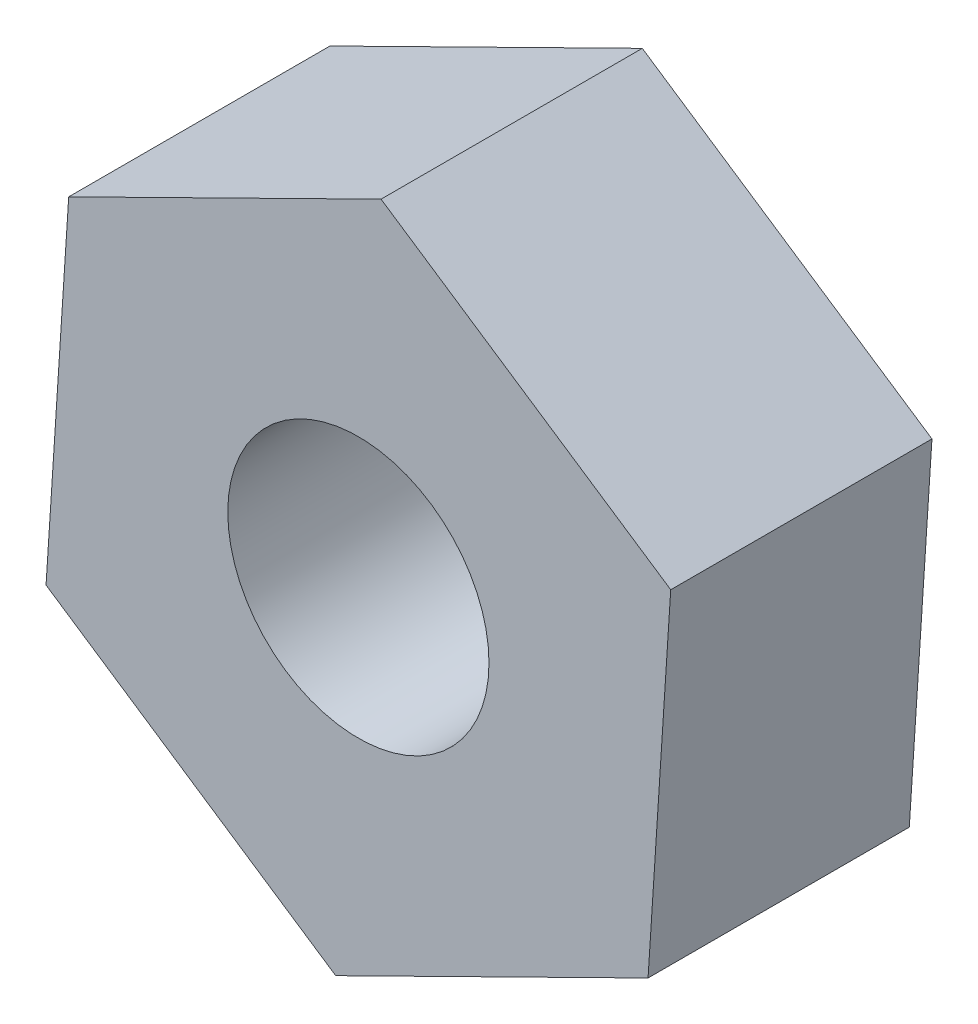
ISO-10303-21;
HEADER;
FILE_DESCRIPTION(('STEP AP214'),'2;1');
FILE_NAME('part.step','',(''),(''),'','','');
FILE_SCHEMA(('AUTOMOTIVE_DESIGN { 1 0 10303 214 1 1 1 1 }'));
ENDSEC;
DATA;
#1=APPLICATION_CONTEXT('core data for automotive mechanical design processes');
#2=APPLICATION_PROTOCOL_DEFINITION('international standard','automotive_design',2000,#1);
#3=PRODUCT_CONTEXT('',#1,'mechanical');
#4=PRODUCT('Part','Part','',(#3));
#5=PRODUCT_RELATED_PRODUCT_CATEGORY('part','',(#4));
#6=PRODUCT_DEFINITION_FORMATION('','',#4);
#7=PRODUCT_DEFINITION_CONTEXT('part definition',#1,'design');
#8=PRODUCT_DEFINITION('design','',#6,#7);
#9=PRODUCT_DEFINITION_SHAPE('','',#8);
#10=(LENGTH_UNIT() NAMED_UNIT(*) SI_UNIT(.MILLI.,.METRE.));
#11=(NAMED_UNIT(*) PLANE_ANGLE_UNIT() SI_UNIT($,.RADIAN.));
#12=(NAMED_UNIT(*) SI_UNIT($,.STERADIAN.) SOLID_ANGLE_UNIT());
#13=UNCERTAINTY_MEASURE_WITH_UNIT(LENGTH_MEASURE(1.E-05),#10,'distance_accuracy_value','');
#14=(GEOMETRIC_REPRESENTATION_CONTEXT(3) GLOBAL_UNCERTAINTY_ASSIGNED_CONTEXT((#13)) GLOBAL_UNIT_ASSIGNED_CONTEXT((#10,
#11,#12)) REPRESENTATION_CONTEXT('',''));
#15=CARTESIAN_POINT('',(0.,0.,0.));
#16=DIRECTION('',(0.,0.,1.));
#17=DIRECTION('',(1.,0.,0.));
#18=AXIS2_PLACEMENT_3D('',#15,#16,#17);
#19=CARTESIAN_POINT('',(-0.260392613435266,-3.99151546243634,3.));
#20=DIRECTION('',(-0.442562778256351,0.896737524196473,0.));
#21=DIRECTION('',(-0.896737524196473,-0.442562778256351,0.));
#22=AXIS2_PLACEMENT_3D('',#19,#20,#21);
#23=PLANE('',#22);
#24=DIRECTION('',(0.896737524196473,0.442562778256351,0.));
#25=VECTOR('',#24,1.);
#26=CARTESIAN_POINT('',(-0.260392613435266,-3.99151546243634,0.));
#27=LINE('',#26,#25);
#28=CARTESIAN_POINT('',(-0.260392613435266,-3.99151546243634,0.));
#29=VERTEX_POINT('',#28);
#30=CARTESIAN_POINT('',(3.32655748335063,-2.22126434941093,0.));
#31=VERTEX_POINT('',#30);
#32=EDGE_CURVE('E128',#29,#31,#27,.T.);
#33=ORIENTED_EDGE('',*,*,#32,.T.);
#34=DIRECTION('',(0.,0.,-1.));
#35=VECTOR('',#34,1.);
#36=CARTESIAN_POINT('',(3.32655748335063,-2.22126434941093,3.));
#37=LINE('',#36,#35);
#38=CARTESIAN_POINT('',(3.32655748335063,-2.22126434941093,3.));
#39=VERTEX_POINT('',#38);
#40=EDGE_CURVE('E11',#39,#31,#37,.T.);
#41=ORIENTED_EDGE('',*,*,#40,.F.);
#42=DIRECTION('',(0.896737524196473,0.442562778256351,0.));
#43=VECTOR('',#42,1.);
#44=CARTESIAN_POINT('',(-0.260392613435266,-3.99151546243634,3.));
#45=LINE('',#44,#43);
#46=CARTESIAN_POINT('',(-0.260392613435266,-3.99151546243634,3.));
#47=VERTEX_POINT('',#46);
#48=EDGE_CURVE('E145',#47,#39,#45,.T.);
#49=ORIENTED_EDGE('',*,*,#48,.F.);
#50=DIRECTION('',(0.,0.,-1.));
#51=VECTOR('',#50,1.);
#52=CARTESIAN_POINT('',(-0.260392613435266,-3.99151546243634,3.));
#53=LINE('',#52,#51);
#54=EDGE_CURVE('E124',#47,#29,#53,.T.);
#55=ORIENTED_EDGE('',*,*,#54,.T.);
#56=EDGE_LOOP('',(#33,#41,#49,#55));
#57=FACE_BOUND('',#56,.T.);
#58=ADVANCED_FACE('F39',(#57),#23,.F.);
#59=CARTESIAN_POINT('',(3.32655748335063,-2.22126434941093,3.));
#60=DIRECTION('',(-0.997878865609084,0.0650981533588165,0.));
#61=DIRECTION('',(-0.0650981533588165,-0.997878865609084,0.));
#62=AXIS2_PLACEMENT_3D('',#59,#60,#61);
#63=PLANE('',#62);
#64=DIRECTION('',(0.0650981533588165,0.997878865609084,0.));
#65=VECTOR('',#64,1.);
#66=CARTESIAN_POINT('',(3.32655748335063,-2.22126434941093,0.));
#67=LINE('',#66,#65);
#68=CARTESIAN_POINT('',(3.58695009678589,1.77025111302541,0.));
#69=VERTEX_POINT('',#68);
#70=EDGE_CURVE('E132',#31,#69,#67,.T.);
#71=ORIENTED_EDGE('',*,*,#70,.T.);
#72=DIRECTION('',(0.,0.,-1.));
#73=VECTOR('',#72,1.);
#74=CARTESIAN_POINT('',(3.58695009678589,1.77025111302541,3.));
#75=LINE('',#74,#73);
#76=CARTESIAN_POINT('',(3.58695009678589,1.77025111302541,3.));
#77=VERTEX_POINT('',#76);
#78=EDGE_CURVE('E48',#77,#69,#75,.T.);
#79=ORIENTED_EDGE('',*,*,#78,.F.);
#80=DIRECTION('',(0.0650981533588165,0.997878865609084,0.));
#81=VECTOR('',#80,1.);
#82=CARTESIAN_POINT('',(3.32655748335063,-2.22126434941093,3.));
#83=LINE('',#82,#81);
#84=EDGE_CURVE('E93',#39,#77,#83,.T.);
#85=ORIENTED_EDGE('',*,*,#84,.F.);
#86=ORIENTED_EDGE('',*,*,#40,.T.);
#87=EDGE_LOOP('',(#71,#79,#85,#86));
#88=FACE_BOUND('',#87,.T.);
#89=ADVANCED_FACE('F174',(#88),#63,.F.);
#90=CARTESIAN_POINT('',(3.58695009678589,1.77025111302541,3.));
#91=DIRECTION('',(-0.555316087352732,-0.831639370837656,0.));
#92=DIRECTION('',(0.831639370837656,-0.555316087352732,0.));
#93=AXIS2_PLACEMENT_3D('',#90,#91,#92);
#94=PLANE('',#93);
#95=DIRECTION('',(-0.831639370837656,0.555316087352732,0.));
#96=VECTOR('',#95,1.);
#97=CARTESIAN_POINT('',(3.58695009678589,1.77025111302541,0.));
#98=LINE('',#97,#96);
#99=CARTESIAN_POINT('',(0.260392613435267,3.99151546243634,0.));
#100=VERTEX_POINT('',#99);
#101=EDGE_CURVE('E136',#69,#100,#98,.T.);
#102=ORIENTED_EDGE('',*,*,#101,.T.);
#103=DIRECTION('',(0.,0.,-1.));
#104=VECTOR('',#103,1.);
#105=CARTESIAN_POINT('',(0.260392613435267,3.99151546243634,3.));
#106=LINE('',#105,#104);
#107=CARTESIAN_POINT('',(0.260392613435267,3.99151546243634,3.));
#108=VERTEX_POINT('',#107);
#109=EDGE_CURVE('E117',#108,#100,#106,.T.);
#110=ORIENTED_EDGE('',*,*,#109,.F.);
#111=DIRECTION('',(-0.831639370837656,0.555316087352732,0.));
#112=VECTOR('',#111,1.);
#113=CARTESIAN_POINT('',(3.58695009678589,1.77025111302541,3.));
#114=LINE('',#113,#112);
#115=EDGE_CURVE('E106',#77,#108,#114,.T.);
#116=ORIENTED_EDGE('',*,*,#115,.F.);
#117=ORIENTED_EDGE('',*,*,#78,.T.);
#118=EDGE_LOOP('',(#102,#110,#116,#117));
#119=FACE_BOUND('',#118,.T.);
#120=ADVANCED_FACE('F155',(#119),#94,.F.);
#121=CARTESIAN_POINT('',(0.260392613435267,3.99151546243634,3.));
#122=DIRECTION('',(0.442562778256351,-0.896737524196473,0.));
#123=DIRECTION('',(0.896737524196473,0.442562778256351,0.));
#124=AXIS2_PLACEMENT_3D('',#121,#122,#123);
#125=PLANE('',#124);
#126=DIRECTION('',(-0.896737524196473,-0.442562778256351,0.));
#127=VECTOR('',#126,1.);
#128=CARTESIAN_POINT('',(0.260392613435267,3.99151546243634,0.));
#129=LINE('',#128,#127);
#130=CARTESIAN_POINT('',(-3.32655748335062,2.22126434941093,0.));
#131=VERTEX_POINT('',#130);
#132=EDGE_CURVE('E115',#100,#131,#129,.T.);
#133=ORIENTED_EDGE('',*,*,#132,.T.);
#134=DIRECTION('',(0.,0.,-1.));
#135=VECTOR('',#134,1.);
#136=CARTESIAN_POINT('',(-3.32655748335062,2.22126434941093,3.));
#137=LINE('',#136,#135);
#138=CARTESIAN_POINT('',(-3.32655748335062,2.22126434941093,3.));
#139=VERTEX_POINT('',#138);
#140=EDGE_CURVE('E112',#139,#131,#137,.T.);
#141=ORIENTED_EDGE('',*,*,#140,.F.);
#142=DIRECTION('',(-0.896737524196473,-0.442562778256351,0.));
#143=VECTOR('',#142,1.);
#144=CARTESIAN_POINT('',(0.260392613435267,3.99151546243634,3.));
#145=LINE('',#144,#143);
#146=EDGE_CURVE('E100',#108,#139,#145,.T.);
#147=ORIENTED_EDGE('',*,*,#146,.F.);
#148=ORIENTED_EDGE('',*,*,#109,.T.);
#149=EDGE_LOOP('',(#133,#141,#147,#148));
#150=FACE_BOUND('',#149,.T.);
#151=ADVANCED_FACE('F113',(#150),#125,.F.);
#152=CARTESIAN_POINT('',(-3.32655748335062,2.22126434941093,3.));
#153=DIRECTION('',(0.997878865609084,-0.0650981533588166,0.));
#154=DIRECTION('',(0.0650981533588166,0.997878865609084,0.));
#155=AXIS2_PLACEMENT_3D('',#152,#153,#154);
#156=PLANE('',#155);
#157=DIRECTION('',(-0.0650981533588166,-0.997878865609084,0.));
#158=VECTOR('',#157,1.);
#159=CARTESIAN_POINT('',(-3.32655748335062,2.22126434941093,0.));
#160=LINE('',#159,#158);
#161=CARTESIAN_POINT('',(-3.58695009678589,-1.77025111302541,0.));
#162=VERTEX_POINT('',#161);
#163=EDGE_CURVE('E79',#131,#162,#160,.T.);
#164=ORIENTED_EDGE('',*,*,#163,.T.);
#165=DIRECTION('',(0.,0.,-1.));
#166=VECTOR('',#165,1.);
#167=CARTESIAN_POINT('',(-3.58695009678589,-1.77025111302541,3.));
#168=LINE('',#167,#166);
#169=CARTESIAN_POINT('',(-3.58695009678589,-1.77025111302541,3.));
#170=VERTEX_POINT('',#169);
#171=EDGE_CURVE('E118',#170,#162,#168,.T.);
#172=ORIENTED_EDGE('',*,*,#171,.F.);
#173=DIRECTION('',(-0.0650981533588166,-0.997878865609084,0.));
#174=VECTOR('',#173,1.);
#175=CARTESIAN_POINT('',(-3.32655748335062,2.22126434941093,3.));
#176=LINE('',#175,#174);
#177=EDGE_CURVE('E104',#139,#170,#176,.T.);
#178=ORIENTED_EDGE('',*,*,#177,.F.);
#179=ORIENTED_EDGE('',*,*,#140,.T.);
#180=EDGE_LOOP('',(#164,#172,#178,#179));
#181=FACE_BOUND('',#180,.T.);
#182=ADVANCED_FACE('F120',(#181),#156,.F.);
#183=CARTESIAN_POINT('',(-3.58695009678589,-1.77025111302541,3.));
#184=DIRECTION('',(0.555316087352732,0.831639370837656,0.));
#185=DIRECTION('',(-0.831639370837656,0.555316087352733,0.));
#186=AXIS2_PLACEMENT_3D('',#183,#184,#185);
#187=PLANE('',#186);
#188=DIRECTION('',(0.831639370837656,-0.555316087352733,0.));
#189=VECTOR('',#188,1.);
#190=CARTESIAN_POINT('',(-3.58695009678589,-1.77025111302541,0.));
#191=LINE('',#190,#189);
#192=EDGE_CURVE('E85',#162,#29,#191,.T.);
#193=ORIENTED_EDGE('',*,*,#192,.T.);
#194=ORIENTED_EDGE('',*,*,#54,.F.);
#195=DIRECTION('',(0.831639370837656,-0.555316087352733,0.));
#196=VECTOR('',#195,1.);
#197=CARTESIAN_POINT('',(-3.58695009678589,-1.77025111302541,3.));
#198=LINE('',#197,#196);
#199=EDGE_CURVE('E56',#170,#47,#198,.T.);
#200=ORIENTED_EDGE('',*,*,#199,.F.);
#201=ORIENTED_EDGE('',*,*,#171,.T.);
#202=EDGE_LOOP('',(#193,#194,#200,#201));
#203=FACE_BOUND('',#202,.T.);
#204=ADVANCED_FACE('F162',(#203),#187,.F.);
#205=CARTESIAN_POINT('',(0.,0.,3.));
#206=DIRECTION('',(0.,0.,1.));
#207=DIRECTION('',(1.,0.,0.));
#208=AXIS2_PLACEMENT_3D('',#205,#206,#207);
#209=PLANE('',#208);
#210=CARTESIAN_POINT('',(0.,0.,3.));
#211=DIRECTION('',(0.,0.,1.));
#212=DIRECTION('',(1.,0.,0.));
#213=AXIS2_PLACEMENT_3D('',#210,#211,#212);
#214=CIRCLE('',#213,1.5);
#215=CARTESIAN_POINT('',(1.5,0.,3.));
#216=VERTEX_POINT('',#215);
#217=EDGE_CURVE('E229',#216,#216,#214,.T.);
#218=ORIENTED_EDGE('',*,*,#217,.F.);
#219=EDGE_LOOP('',(#218));
#220=FACE_BOUND('',#219,.T.);
#221=ORIENTED_EDGE('',*,*,#48,.T.);
#222=ORIENTED_EDGE('',*,*,#84,.T.);
#223=ORIENTED_EDGE('',*,*,#115,.T.);
#224=ORIENTED_EDGE('',*,*,#146,.T.);
#225=ORIENTED_EDGE('',*,*,#177,.T.);
#226=ORIENTED_EDGE('',*,*,#199,.T.);
#227=EDGE_LOOP('',(#221,#222,#223,#224,#225,#226));
#228=FACE_BOUND('',#227,.T.);
#229=ADVANCED_FACE('F102',(#220,#228),#209,.T.);
#230=CARTESIAN_POINT('',(0.,0.,0.));
#231=DIRECTION('',(0.,0.,1.));
#232=DIRECTION('',(1.,0.,0.));
#233=AXIS2_PLACEMENT_3D('',#230,#231,#232);
#234=PLANE('',#233);
#235=CARTESIAN_POINT('',(0.,0.,0.));
#236=DIRECTION('',(0.,0.,1.));
#237=DIRECTION('',(1.,0.,0.));
#238=AXIS2_PLACEMENT_3D('',#235,#236,#237);
#239=CIRCLE('',#238,1.5);
#240=CARTESIAN_POINT('',(1.5,0.,0.));
#241=VERTEX_POINT('',#240);
#242=EDGE_CURVE('E133',#241,#241,#239,.T.);
#243=ORIENTED_EDGE('',*,*,#242,.T.);
#244=EDGE_LOOP('',(#243));
#245=FACE_BOUND('',#244,.T.);
#246=ORIENTED_EDGE('',*,*,#32,.F.);
#247=ORIENTED_EDGE('',*,*,#192,.F.);
#248=ORIENTED_EDGE('',*,*,#163,.F.);
#249=ORIENTED_EDGE('',*,*,#132,.F.);
#250=ORIENTED_EDGE('',*,*,#101,.F.);
#251=ORIENTED_EDGE('',*,*,#70,.F.);
#252=EDGE_LOOP('',(#246,#247,#248,#249,#250,#251));
#253=FACE_BOUND('',#252,.T.);
#254=ADVANCED_FACE('F158',(#245,#253),#234,.F.);
#255=CARTESIAN_POINT('',(0.,0.,0.));
#256=DIRECTION('',(0.,0.,1.));
#257=DIRECTION('',(1.,0.,0.));
#258=AXIS2_PLACEMENT_3D('',#255,#256,#257);
#259=CYLINDRICAL_SURFACE('',#258,1.5);
#260=ORIENTED_EDGE('',*,*,#242,.F.);
#261=EDGE_LOOP('',(#260));
#262=FACE_BOUND('',#261,.T.);
#263=ORIENTED_EDGE('',*,*,#217,.T.);
#264=EDGE_LOOP('',(#263));
#265=FACE_BOUND('',#264,.T.);
#266=ADVANCED_FACE('F211',(#262,#265),#259,.F.);
#267=CLOSED_SHELL('',(#58,#89,#120,#151,#182,#204,#229,#254,#266));
#268=MANIFOLD_SOLID_BREP('B2',#267);
#269=ADVANCED_BREP_SHAPE_REPRESENTATION('',(#18,#268),#14);
#270=SHAPE_DEFINITION_REPRESENTATION(#9,#269);
ENDSEC;
END-ISO-10303-21;
